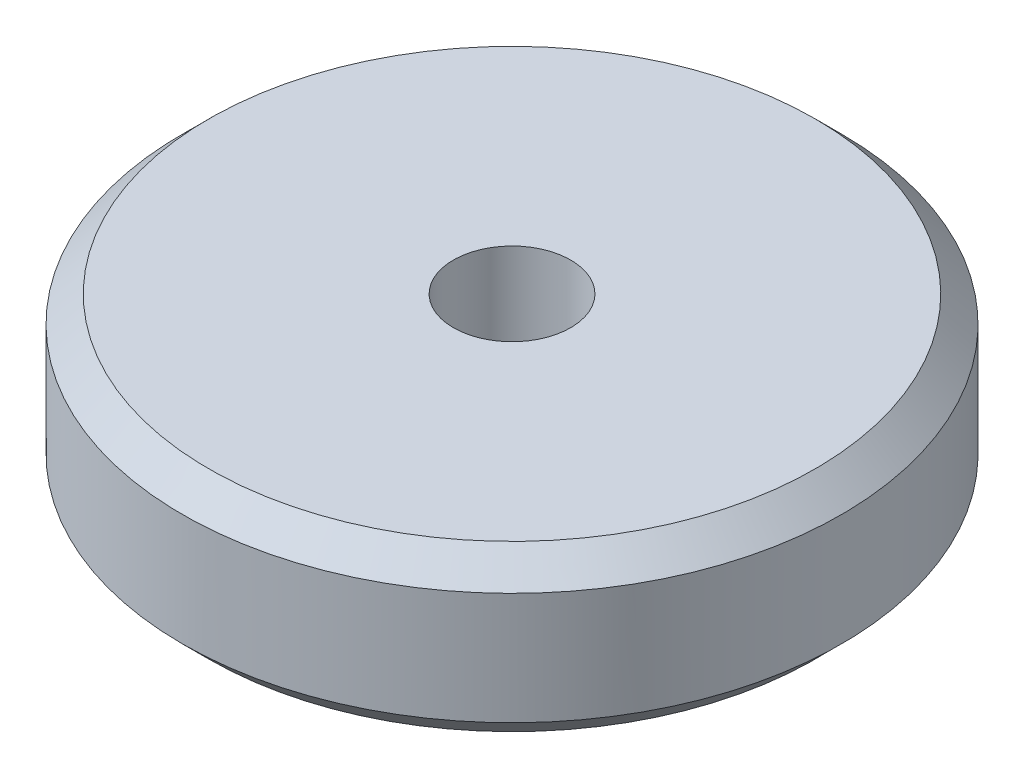
ISO-10303-21;
HEADER;
FILE_DESCRIPTION(('STEP AP214'),'2;1');
FILE_NAME('part.step','',(''),(''),'','','');
FILE_SCHEMA(('AUTOMOTIVE_DESIGN { 1 0 10303 214 1 1 1 1 }'));
ENDSEC;
DATA;
#1=APPLICATION_CONTEXT('core data for automotive mechanical design processes');
#2=APPLICATION_PROTOCOL_DEFINITION('international standard','automotive_design',2000,#1);
#3=PRODUCT_CONTEXT('',#1,'mechanical');
#4=PRODUCT('Part','Part','',(#3));
#5=PRODUCT_RELATED_PRODUCT_CATEGORY('part','',(#4));
#6=PRODUCT_DEFINITION_FORMATION('','',#4);
#7=PRODUCT_DEFINITION_CONTEXT('part definition',#1,'design');
#8=PRODUCT_DEFINITION('design','',#6,#7);
#9=PRODUCT_DEFINITION_SHAPE('','',#8);
#10=(LENGTH_UNIT() NAMED_UNIT(*) SI_UNIT(.MILLI.,.METRE.));
#11=(NAMED_UNIT(*) PLANE_ANGLE_UNIT() SI_UNIT($,.RADIAN.));
#12=(NAMED_UNIT(*) SI_UNIT($,.STERADIAN.) SOLID_ANGLE_UNIT());
#13=UNCERTAINTY_MEASURE_WITH_UNIT(LENGTH_MEASURE(1.E-05),#10,'distance_accuracy_value','');
#14=(GEOMETRIC_REPRESENTATION_CONTEXT(3) GLOBAL_UNCERTAINTY_ASSIGNED_CONTEXT((#13)) GLOBAL_UNIT_ASSIGNED_CONTEXT((#10,
#11,#12)) REPRESENTATION_CONTEXT('',''));
#15=CARTESIAN_POINT('',(0.,0.,0.));
#16=DIRECTION('',(0.,0.,1.));
#17=DIRECTION('',(1.,0.,0.));
#18=AXIS2_PLACEMENT_3D('',#15,#16,#17);
#19=CARTESIAN_POINT('',(0.,3.175,0.));
#20=DIRECTION('',(0.,-1.,0.));
#21=DIRECTION('',(0.,0.,-1.));
#22=AXIS2_PLACEMENT_3D('',#19,#20,#21);
#23=CYLINDRICAL_SURFACE('',#22,6.35);
#24=CARTESIAN_POINT('',(0.,0.508000000000002,0.));
#25=DIRECTION('',(0.,1.,0.));
#26=DIRECTION('',(0.,0.,1.));
#27=AXIS2_PLACEMENT_3D('',#24,#25,#26);
#28=CIRCLE('',#27,6.35);
#29=CARTESIAN_POINT('',(0.,0.508000000000002,6.35));
#30=VERTEX_POINT('',#29);
#31=EDGE_CURVE('E44',#30,#30,#28,.T.);
#32=ORIENTED_EDGE('',*,*,#31,.T.);
#33=EDGE_LOOP('',(#32));
#34=FACE_BOUND('',#33,.T.);
#35=CARTESIAN_POINT('',(0.,2.667,0.));
#36=DIRECTION('',(0.,1.,0.));
#37=DIRECTION('',(0.,0.,1.));
#38=AXIS2_PLACEMENT_3D('',#35,#36,#37);
#39=CIRCLE('',#38,6.35);
#40=CARTESIAN_POINT('',(0.,2.667,-6.35));
#41=VERTEX_POINT('',#40);
#42=EDGE_CURVE('E48',#41,#41,#39,.F.);
#43=ORIENTED_EDGE('',*,*,#42,.T.);
#44=EDGE_LOOP('',(#43));
#45=FACE_BOUND('',#44,.T.);
#46=ADVANCED_FACE('F33',(#34,#45),#23,.T.);
#47=CARTESIAN_POINT('',(0.,3.175,0.));
#48=DIRECTION('',(0.,1.,0.));
#49=DIRECTION('',(0.,0.,1.));
#50=AXIS2_PLACEMENT_3D('',#47,#48,#49);
#51=PLANE('',#50);
#52=CARTESIAN_POINT('',(0.,3.175,0.));
#53=DIRECTION('',(0.,1.,0.));
#54=DIRECTION('',(0.,0.,1.));
#55=AXIS2_PLACEMENT_3D('',#52,#53,#54);
#56=CIRCLE('',#55,5.842);
#57=CARTESIAN_POINT('',(0.,3.175,-5.842));
#58=VERTEX_POINT('',#57);
#59=EDGE_CURVE('E10',#58,#58,#56,.T.);
#60=ORIENTED_EDGE('',*,*,#59,.T.);
#61=EDGE_LOOP('',(#60));
#62=FACE_BOUND('',#61,.T.);
#63=CARTESIAN_POINT('',(0.,3.175,0.));
#64=DIRECTION('',(0.,1.,0.));
#65=DIRECTION('',(0.,0.,1.));
#66=AXIS2_PLACEMENT_3D('',#63,#64,#65);
#67=CIRCLE('',#66,1.13029999999999);
#68=CARTESIAN_POINT('',(0.,3.175,1.13029999999999));
#69=VERTEX_POINT('',#68);
#70=EDGE_CURVE('E56',#69,#69,#67,.T.);
#71=ORIENTED_EDGE('',*,*,#70,.F.);
#72=EDGE_LOOP('',(#71));
#73=FACE_BOUND('',#72,.T.);
#74=ADVANCED_FACE('F62',(#62,#73),#51,.T.);
#75=CARTESIAN_POINT('',(0.,0.,0.));
#76=DIRECTION('',(0.,1.,0.));
#77=DIRECTION('',(0.,0.,1.));
#78=AXIS2_PLACEMENT_3D('',#75,#76,#77);
#79=PLANE('',#78);
#80=CARTESIAN_POINT('',(0.,0.,0.));
#81=DIRECTION('',(0.,1.,0.));
#82=DIRECTION('',(0.,0.,1.));
#83=AXIS2_PLACEMENT_3D('',#80,#81,#82);
#84=CIRCLE('',#83,5.842);
#85=CARTESIAN_POINT('',(0.,0.,5.842));
#86=VERTEX_POINT('',#85);
#87=EDGE_CURVE('E40',#86,#86,#84,.F.);
#88=ORIENTED_EDGE('',*,*,#87,.T.);
#89=EDGE_LOOP('',(#88));
#90=FACE_BOUND('',#89,.T.);
#91=CARTESIAN_POINT('',(0.,0.,0.));
#92=DIRECTION('',(0.,1.,0.));
#93=DIRECTION('',(0.,0.,1.));
#94=AXIS2_PLACEMENT_3D('',#91,#92,#93);
#95=CIRCLE('',#94,1.1303);
#96=CARTESIAN_POINT('',(0.,0.,1.1303));
#97=VERTEX_POINT('',#96);
#98=EDGE_CURVE('E53',#97,#97,#95,.T.);
#99=ORIENTED_EDGE('',*,*,#98,.T.);
#100=EDGE_LOOP('',(#99));
#101=FACE_BOUND('',#100,.T.);
#102=ADVANCED_FACE('F64',(#90,#101),#79,.F.);
#103=CARTESIAN_POINT('',(0.,3.175,0.));
#104=DIRECTION('',(0.,1.,0.));
#105=DIRECTION('',(0.,0.,1.));
#106=AXIS2_PLACEMENT_3D('',#103,#104,#105);
#107=CYLINDRICAL_SURFACE('',#106,1.13029999999999);
#108=ORIENTED_EDGE('',*,*,#98,.F.);
#109=EDGE_LOOP('',(#108));
#110=FACE_BOUND('',#109,.T.);
#111=ORIENTED_EDGE('',*,*,#70,.T.);
#112=EDGE_LOOP('',(#111));
#113=FACE_BOUND('',#112,.T.);
#114=ADVANCED_FACE('F60',(#110,#113),#107,.F.);
#115=CARTESIAN_POINT('',(0.,0.508000000000002,0.));
#116=DIRECTION('',(0.,1.,0.));
#117=DIRECTION('',(0.,0.,1.));
#118=AXIS2_PLACEMENT_3D('',#115,#116,#117);
#119=CONICAL_SURFACE('',#118,6.35,0.785398163397449);
#120=ORIENTED_EDGE('',*,*,#87,.F.);
#121=EDGE_LOOP('',(#120));
#122=FACE_BOUND('',#121,.T.);
#123=ORIENTED_EDGE('',*,*,#31,.F.);
#124=EDGE_LOOP('',(#123));
#125=FACE_BOUND('',#124,.T.);
#126=ADVANCED_FACE('F74',(#122,#125),#119,.T.);
#127=CARTESIAN_POINT('',(0.,3.175,0.));
#128=DIRECTION('',(0.,-1.,0.));
#129=DIRECTION('',(0.,0.,-1.));
#130=AXIS2_PLACEMENT_3D('',#127,#128,#129);
#131=CONICAL_SURFACE('',#130,5.842,0.785398163397447);
#132=CARTESIAN_POINT('',(0.,2.667,-6.35));
#133=CARTESIAN_POINT('',(0.,2.67229166666666,-6.34470833333333));
#134=CARTESIAN_POINT('',(0.,2.67758333333333,-6.33941666666667));
#135=CARTESIAN_POINT('',(0.,2.68816666666666,-6.32883333333333));
#136=CARTESIAN_POINT('',(0.,2.69345833333333,-6.32354166666667));
#137=CARTESIAN_POINT('',(0.,2.70404166666666,-6.31295833333333));
#138=CARTESIAN_POINT('',(0.,2.70933333333333,-6.30766666666667));
#139=CARTESIAN_POINT('',(0.,2.71991666666666,-6.29708333333333));
#140=CARTESIAN_POINT('',(0.,2.72520833333333,-6.29179166666667));
#141=CARTESIAN_POINT('',(0.,2.73579166666666,-6.28120833333333));
#142=CARTESIAN_POINT('',(0.,2.74108333333333,-6.27591666666667));
#143=CARTESIAN_POINT('',(0.,2.75166666666666,-6.26533333333333));
#144=CARTESIAN_POINT('',(0.,2.75695833333333,-6.26004166666667));
#145=CARTESIAN_POINT('',(0.,2.76754166666666,-6.24945833333333));
#146=CARTESIAN_POINT('',(0.,2.77283333333333,-6.24416666666667));
#147=CARTESIAN_POINT('',(0.,2.78341666666666,-6.23358333333333));
#148=CARTESIAN_POINT('',(0.,2.78870833333333,-6.22829166666667));
#149=CARTESIAN_POINT('',(0.,2.79929166666666,-6.21770833333333));
#150=CARTESIAN_POINT('',(0.,2.80458333333333,-6.21241666666667));
#151=CARTESIAN_POINT('',(0.,2.81516666666666,-6.20183333333333));
#152=CARTESIAN_POINT('',(0.,2.82045833333333,-6.19654166666667));
#153=CARTESIAN_POINT('',(0.,2.83104166666666,-6.18595833333333));
#154=CARTESIAN_POINT('',(0.,2.83633333333333,-6.18066666666667));
#155=CARTESIAN_POINT('',(0.,2.84691666666666,-6.17008333333333));
#156=CARTESIAN_POINT('',(0.,2.85220833333333,-6.16479166666667));
#157=CARTESIAN_POINT('',(0.,2.86279166666666,-6.15420833333333));
#158=CARTESIAN_POINT('',(0.,2.86808333333333,-6.14891666666667));
#159=CARTESIAN_POINT('',(0.,2.87866666666666,-6.13833333333333));
#160=CARTESIAN_POINT('',(0.,2.88395833333333,-6.13304166666667));
#161=CARTESIAN_POINT('',(0.,2.89454166666666,-6.12245833333333));
#162=CARTESIAN_POINT('',(0.,2.89983333333333,-6.11716666666667));
#163=CARTESIAN_POINT('',(0.,2.91041666666666,-6.10658333333333));
#164=CARTESIAN_POINT('',(0.,2.91570833333333,-6.10129166666666));
#165=CARTESIAN_POINT('',(0.,2.92629166666666,-6.09070833333333));
#166=CARTESIAN_POINT('',(0.,2.93158333333333,-6.08541666666667));
#167=CARTESIAN_POINT('',(0.,2.94216666666666,-6.07483333333333));
#168=CARTESIAN_POINT('',(0.,2.94745833333333,-6.06954166666667));
#169=CARTESIAN_POINT('',(0.,2.95804166666666,-6.05895833333333));
#170=CARTESIAN_POINT('',(0.,2.96333333333333,-6.05366666666666));
#171=CARTESIAN_POINT('',(0.,2.97391666666666,-6.04308333333333));
#172=CARTESIAN_POINT('',(0.,2.97920833333333,-6.03779166666666));
#173=CARTESIAN_POINT('',(0.,2.98979166666666,-6.02720833333333));
#174=CARTESIAN_POINT('',(0.,2.99508333333333,-6.02191666666666));
#175=CARTESIAN_POINT('',(0.,3.00566666666667,-6.01133333333333));
#176=CARTESIAN_POINT('',(0.,3.01095833333333,-6.00604166666666));
#177=CARTESIAN_POINT('',(0.,3.02154166666667,-5.99545833333333));
#178=CARTESIAN_POINT('',(0.,3.02683333333333,-5.99016666666666));
#179=CARTESIAN_POINT('',(0.,3.03741666666667,-5.97958333333333));
#180=CARTESIAN_POINT('',(0.,3.04270833333333,-5.97429166666666));
#181=CARTESIAN_POINT('',(0.,3.05329166666667,-5.96370833333333));
#182=CARTESIAN_POINT('',(0.,3.05858333333333,-5.95841666666666));
#183=CARTESIAN_POINT('',(0.,3.06916666666667,-5.94783333333333));
#184=CARTESIAN_POINT('',(0.,3.07445833333333,-5.94254166666666));
#185=CARTESIAN_POINT('',(0.,3.08504166666667,-5.93195833333333));
#186=CARTESIAN_POINT('',(0.,3.09033333333333,-5.92666666666666));
#187=CARTESIAN_POINT('',(0.,3.10091666666667,-5.91608333333333));
#188=CARTESIAN_POINT('',(0.,3.10620833333333,-5.91079166666666));
#189=CARTESIAN_POINT('',(0.,3.11679166666667,-5.90020833333333));
#190=CARTESIAN_POINT('',(0.,3.12208333333333,-5.89491666666666));
#191=CARTESIAN_POINT('',(0.,3.13266666666667,-5.88433333333333));
#192=CARTESIAN_POINT('',(0.,3.13795833333333,-5.87904166666666));
#193=CARTESIAN_POINT('',(0.,3.14854166666667,-5.86845833333333));
#194=CARTESIAN_POINT('',(0.,3.15383333333333,-5.86316666666666));
#195=CARTESIAN_POINT('',(0.,3.16441666666667,-5.85258333333333));
#196=CARTESIAN_POINT('',(0.,3.16970833333333,-5.84729166666666));
#197=CARTESIAN_POINT('',(0.,3.175,-5.842));
#198=B_SPLINE_CURVE_WITH_KNOTS('',3,(#132,#133,#134,#135,#136,#137,#138,#139,#140,#141,#142,
#143,#144,#145,#146,#147,#148,#149,#150,#151,#152,#153,#154,#155,#156,#157,#158,#159,#160,#161,
#162,#163,#164,#165,#166,#167,#168,#169,#170,#171,#172,#173,#174,#175,#176,#177,#178,#179,#180,
#181,#182,#183,#184,#185,#186,#187,#188,#189,#190,#191,#192,#193,#194,#195,#196,#197),
.UNSPECIFIED.,.F.,.F.,(4,2,2,2,2,2,2,2,2,2,2,2,2,2,2,2,2,2,2,2,2,2,2,2,2,2,2,2,2,2,2,2,4),(0.,
0.0224506403026726,0.0449012806053456,0.0673519209080189,0.0898025612106921,0.112253201513365,
0.134703841816038,0.157154482118711,0.179605122421384,0.202055762724057,0.22450640302673,
0.246957043329404,0.269407683632076,0.291858323934749,0.314308964237423,0.336759604540096,
0.359210244842769,0.381660885145441,0.404111525448115,0.426562165750788,0.449012806053461,
0.471463446356134,0.493914086658807,0.51636472696148,0.538815367264153,0.561266007566826,
0.583716647869499,0.606167288172172,0.628617928474845,0.651068568777518,0.673519209080191,
0.695969849382865,0.718420489685538),.UNSPECIFIED.);
#199=EDGE_CURVE('BSEAM35',#41,#58,#198,.T.);
#200=ORIENTED_EDGE('',*,*,#42,.F.);
#201=ORIENTED_EDGE('',*,*,#59,.F.);
#202=ORIENTED_EDGE('',*,*,#199,.T.);
#203=ORIENTED_EDGE('',*,*,#199,.F.);
#204=EDGE_LOOP('',(#200,#202,#201,#203));
#205=FACE_BOUND('',#204,.T.);
#206=ADVANCED_FACE('F35',(#205),#131,.T.);
#207=CLOSED_SHELL('',(#46,#74,#102,#114,#126,#206));
#208=MANIFOLD_SOLID_BREP('B2',#207);
#209=ADVANCED_BREP_SHAPE_REPRESENTATION('',(#18,#208),#14);
#210=SHAPE_DEFINITION_REPRESENTATION(#9,#209);
ENDSEC;
END-ISO-10303-21;
